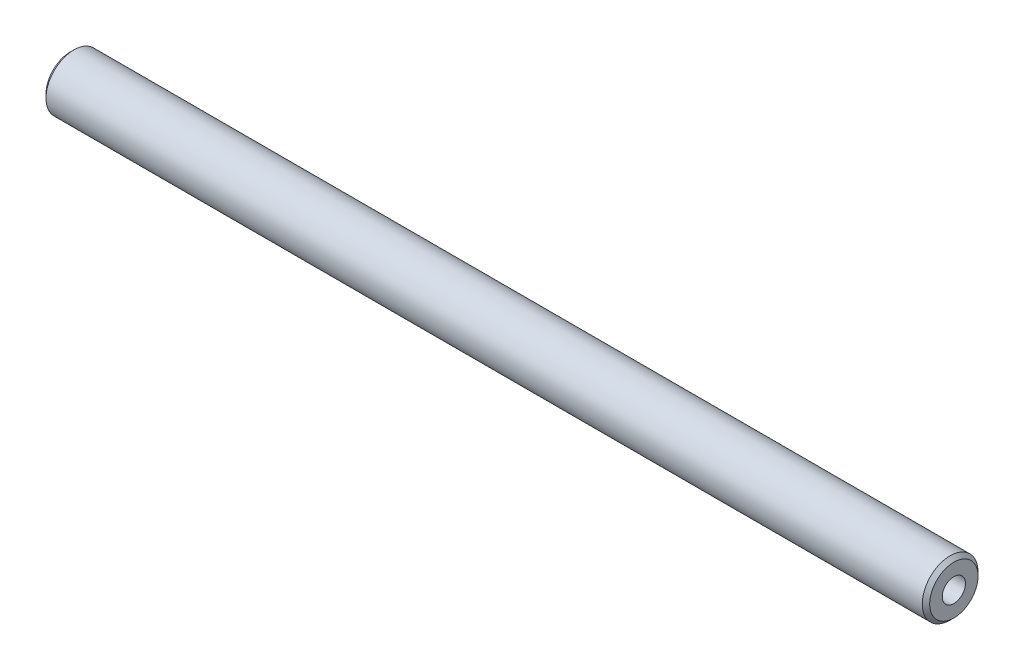
ISO-10303-21;
HEADER;
FILE_DESCRIPTION(('STEP AP214'),'2;1');
FILE_NAME('part.step','',(''),(''),'','','');
FILE_SCHEMA(('AUTOMOTIVE_DESIGN { 1 0 10303 214 1 1 1 1 }'));
ENDSEC;
DATA;
#1=APPLICATION_CONTEXT('core data for automotive mechanical design processes');
#2=APPLICATION_PROTOCOL_DEFINITION('international standard','automotive_design',2000,#1);
#3=PRODUCT_CONTEXT('',#1,'mechanical');
#4=PRODUCT('Part','Part','',(#3));
#5=PRODUCT_RELATED_PRODUCT_CATEGORY('part','',(#4));
#6=PRODUCT_DEFINITION_FORMATION('','',#4);
#7=PRODUCT_DEFINITION_CONTEXT('part definition',#1,'design');
#8=PRODUCT_DEFINITION('design','',#6,#7);
#9=PRODUCT_DEFINITION_SHAPE('','',#8);
#10=(LENGTH_UNIT() NAMED_UNIT(*) SI_UNIT(.MILLI.,.METRE.));
#11=(NAMED_UNIT(*) PLANE_ANGLE_UNIT() SI_UNIT($,.RADIAN.));
#12=(NAMED_UNIT(*) SI_UNIT($,.STERADIAN.) SOLID_ANGLE_UNIT());
#13=UNCERTAINTY_MEASURE_WITH_UNIT(LENGTH_MEASURE(1.E-05),#10,'distance_accuracy_value','');
#14=(GEOMETRIC_REPRESENTATION_CONTEXT(3) GLOBAL_UNCERTAINTY_ASSIGNED_CONTEXT((#13)) GLOBAL_UNIT_ASSIGNED_CONTEXT((#10,
#11,#12)) REPRESENTATION_CONTEXT('',''));
#15=CARTESIAN_POINT('',(0.,0.,0.));
#16=DIRECTION('',(0.,0.,1.));
#17=DIRECTION('',(1.,0.,0.));
#18=AXIS2_PLACEMENT_3D('',#15,#16,#17);
#19=CARTESIAN_POINT('',(0.,3.,0.));
#20=DIRECTION('',(1.,0.,0.));
#21=DIRECTION('',(0.,0.,-1.));
#22=AXIS2_PLACEMENT_3D('',#19,#20,#21);
#23=PLANE('',#22);
#24=CARTESIAN_POINT('',(0.,0.,0.));
#25=DIRECTION('',(-1.,0.,0.));
#26=DIRECTION('',(0.,0.,1.));
#27=AXIS2_PLACEMENT_3D('',#24,#25,#26);
#28=CIRCLE('',#27,1.25);
#29=CARTESIAN_POINT('',(0.,0.,1.25));
#30=VERTEX_POINT('',#29);
#31=EDGE_CURVE('E63',#30,#30,#28,.T.);
#32=ORIENTED_EDGE('',*,*,#31,.F.);
#33=EDGE_LOOP('',(#32));
#34=FACE_BOUND('',#33,.T.);
#35=CARTESIAN_POINT('',(0.,0.,0.));
#36=DIRECTION('',(1.,0.,0.));
#37=DIRECTION('',(0.,0.,-1.));
#38=AXIS2_PLACEMENT_3D('',#35,#36,#37);
#39=CIRCLE('',#38,2.6);
#40=CARTESIAN_POINT('',(0.,0.,-2.6));
#41=VERTEX_POINT('',#40);
#42=EDGE_CURVE('E11',#41,#41,#39,.F.);
#43=ORIENTED_EDGE('',*,*,#42,.T.);
#44=EDGE_LOOP('',(#43));
#45=FACE_BOUND('',#44,.T.);
#46=ADVANCED_FACE('F37',(#34,#45),#23,.F.);
#47=CARTESIAN_POINT('',(95.,3.,0.));
#48=DIRECTION('',(-1.,0.,0.));
#49=DIRECTION('',(0.,0.,1.));
#50=AXIS2_PLACEMENT_3D('',#47,#48,#49);
#51=PLANE('',#50);
#52=CARTESIAN_POINT('',(95.,0.,0.));
#53=DIRECTION('',(1.,0.,0.));
#54=DIRECTION('',(0.,0.,-1.));
#55=AXIS2_PLACEMENT_3D('',#52,#53,#54);
#56=CIRCLE('',#55,1.25);
#57=CARTESIAN_POINT('',(95.,0.,-1.25));
#58=VERTEX_POINT('',#57);
#59=EDGE_CURVE('E60',#58,#58,#56,.T.);
#60=ORIENTED_EDGE('',*,*,#59,.F.);
#61=EDGE_LOOP('',(#60));
#62=FACE_BOUND('',#61,.T.);
#63=CARTESIAN_POINT('',(95.,0.,0.));
#64=DIRECTION('',(-1.,0.,0.));
#65=DIRECTION('',(0.,0.,1.));
#66=AXIS2_PLACEMENT_3D('',#63,#64,#65);
#67=CIRCLE('',#66,2.59999999999998);
#68=CARTESIAN_POINT('',(95.,0.,2.59999999999998));
#69=VERTEX_POINT('',#68);
#70=EDGE_CURVE('E45',#69,#69,#67,.F.);
#71=ORIENTED_EDGE('',*,*,#70,.T.);
#72=EDGE_LOOP('',(#71));
#73=FACE_BOUND('',#72,.T.);
#74=ADVANCED_FACE('F79',(#62,#73),#51,.F.);
#75=CARTESIAN_POINT('',(0.,0.,0.));
#76=DIRECTION('',(-1.,0.,0.));
#77=DIRECTION('',(0.,0.,1.));
#78=AXIS2_PLACEMENT_3D('',#75,#76,#77);
#79=CYLINDRICAL_SURFACE('',#78,3.);
#80=CARTESIAN_POINT('',(94.6,0.,0.));
#81=DIRECTION('',(-1.,0.,0.));
#82=DIRECTION('',(0.,0.,1.));
#83=AXIS2_PLACEMENT_3D('',#80,#81,#82);
#84=CIRCLE('',#83,3.);
#85=CARTESIAN_POINT('',(94.6,0.,3.));
#86=VERTEX_POINT('',#85);
#87=EDGE_CURVE('E74',#86,#86,#84,.T.);
#88=ORIENTED_EDGE('',*,*,#87,.T.);
#89=EDGE_LOOP('',(#88));
#90=FACE_BOUND('',#89,.T.);
#91=CARTESIAN_POINT('',(0.400000000000005,0.,0.));
#92=DIRECTION('',(1.,0.,0.));
#93=DIRECTION('',(0.,0.,-1.));
#94=AXIS2_PLACEMENT_3D('',#91,#92,#93);
#95=CIRCLE('',#94,3.);
#96=CARTESIAN_POINT('',(0.400000000000005,0.,-3.));
#97=VERTEX_POINT('',#96);
#98=EDGE_CURVE('E71',#97,#97,#95,.T.);
#99=ORIENTED_EDGE('',*,*,#98,.T.);
#100=EDGE_LOOP('',(#99));
#101=FACE_BOUND('',#100,.T.);
#102=ADVANCED_FACE('F84',(#90,#101),#79,.T.);
#103=CARTESIAN_POINT('',(94.6,0.,0.));
#104=DIRECTION('',(-1.,0.,0.));
#105=DIRECTION('',(0.,0.,1.));
#106=AXIS2_PLACEMENT_3D('',#103,#104,#105);
#107=CONICAL_SURFACE('',#106,3.,0.785398163397446);
#108=ORIENTED_EDGE('',*,*,#70,.F.);
#109=EDGE_LOOP('',(#108));
#110=FACE_BOUND('',#109,.T.);
#111=ORIENTED_EDGE('',*,*,#87,.F.);
#112=EDGE_LOOP('',(#111));
#113=FACE_BOUND('',#112,.T.);
#114=ADVANCED_FACE('F81',(#110,#113),#107,.T.);
#115=CARTESIAN_POINT('',(0.,0.,0.));
#116=DIRECTION('',(1.,0.,0.));
#117=DIRECTION('',(0.,0.,-1.));
#118=AXIS2_PLACEMENT_3D('',#115,#116,#117);
#119=CONICAL_SURFACE('',#118,2.6,0.785398163397436);
#120=ORIENTED_EDGE('',*,*,#98,.F.);
#121=EDGE_LOOP('',(#120));
#122=FACE_BOUND('',#121,.T.);
#123=ORIENTED_EDGE('',*,*,#42,.F.);
#124=EDGE_LOOP('',(#123));
#125=FACE_BOUND('',#124,.T.);
#126=ADVANCED_FACE('F39',(#122,#125),#119,.T.);
#127=CARTESIAN_POINT('',(8.5,0.,0.));
#128=DIRECTION('',(-1.,0.,0.));
#129=DIRECTION('',(0.,0.,1.));
#130=AXIS2_PLACEMENT_3D('',#127,#128,#129);
#131=CONICAL_SURFACE('',#130,1.25,1.02974425867666);
#132=CARTESIAN_POINT('',(9.25107577378445,0.,0.));
#133=VERTEX_POINT('',#132);
#134=VERTEX_LOOP('',#133);
#135=FACE_BOUND('',#134,.T.);
#136=CARTESIAN_POINT('',(8.5,0.,0.));
#137=DIRECTION('',(-1.,0.,0.));
#138=DIRECTION('',(0.,0.,1.));
#139=AXIS2_PLACEMENT_3D('',#136,#137,#138);
#140=CIRCLE('',#139,1.25);
#141=CARTESIAN_POINT('',(8.5,0.,1.25));
#142=VERTEX_POINT('',#141);
#143=EDGE_CURVE('E68',#142,#142,#140,.T.);
#144=ORIENTED_EDGE('',*,*,#143,.T.);
#145=EDGE_LOOP('',(#144));
#146=FACE_BOUND('',#145,.T.);
#147=ADVANCED_FACE('F94',(#135,#146),#131,.F.);
#148=CARTESIAN_POINT('',(0.,0.,0.));
#149=DIRECTION('',(-1.,0.,0.));
#150=DIRECTION('',(0.,0.,1.));
#151=AXIS2_PLACEMENT_3D('',#148,#149,#150);
#152=CYLINDRICAL_SURFACE('',#151,1.25);
#153=ORIENTED_EDGE('',*,*,#143,.F.);
#154=EDGE_LOOP('',(#153));
#155=FACE_BOUND('',#154,.T.);
#156=ORIENTED_EDGE('',*,*,#31,.T.);
#157=EDGE_LOOP('',(#156));
#158=FACE_BOUND('',#157,.T.);
#159=ADVANCED_FACE('F109',(#155,#158),#152,.F.);
#160=CARTESIAN_POINT('',(95.,0.,0.));
#161=DIRECTION('',(1.,0.,0.));
#162=DIRECTION('',(0.,0.,-1.));
#163=AXIS2_PLACEMENT_3D('',#160,#161,#162);
#164=CYLINDRICAL_SURFACE('',#163,1.25);
#165=CARTESIAN_POINT('',(86.5,0.,0.));
#166=DIRECTION('',(1.,0.,0.));
#167=DIRECTION('',(0.,0.,-1.));
#168=AXIS2_PLACEMENT_3D('',#165,#166,#167);
#169=CIRCLE('',#168,1.25);
#170=CARTESIAN_POINT('',(86.5,0.,-1.25));
#171=VERTEX_POINT('',#170);
#172=EDGE_CURVE('E58',#171,#171,#169,.T.);
#173=ORIENTED_EDGE('',*,*,#172,.F.);
#174=EDGE_LOOP('',(#173));
#175=FACE_BOUND('',#174,.T.);
#176=ORIENTED_EDGE('',*,*,#59,.T.);
#177=EDGE_LOOP('',(#176));
#178=FACE_BOUND('',#177,.T.);
#179=ADVANCED_FACE('F54',(#175,#178),#164,.F.);
#180=CARTESIAN_POINT('',(86.5,0.,0.));
#181=DIRECTION('',(1.,0.,0.));
#182=DIRECTION('',(0.,0.,-1.));
#183=AXIS2_PLACEMENT_3D('',#180,#181,#182);
#184=CONICAL_SURFACE('',#183,1.25,1.02974425867666);
#185=CARTESIAN_POINT('',(85.7489242262155,0.,0.));
#186=VERTEX_POINT('',#185);
#187=VERTEX_LOOP('',#186);
#188=FACE_BOUND('',#187,.T.);
#189=ORIENTED_EDGE('',*,*,#172,.T.);
#190=EDGE_LOOP('',(#189));
#191=FACE_BOUND('',#190,.T.);
#192=ADVANCED_FACE('F51',(#188,#191),#184,.F.);
#193=CLOSED_SHELL('',(#46,#74,#102,#114,#126,#147,#159,#179,#192));
#194=MANIFOLD_SOLID_BREP('B2',#193);
#195=ADVANCED_BREP_SHAPE_REPRESENTATION('',(#18,#194),#14);
#196=SHAPE_DEFINITION_REPRESENTATION(#9,#195);
ENDSEC;
END-ISO-10303-21;
